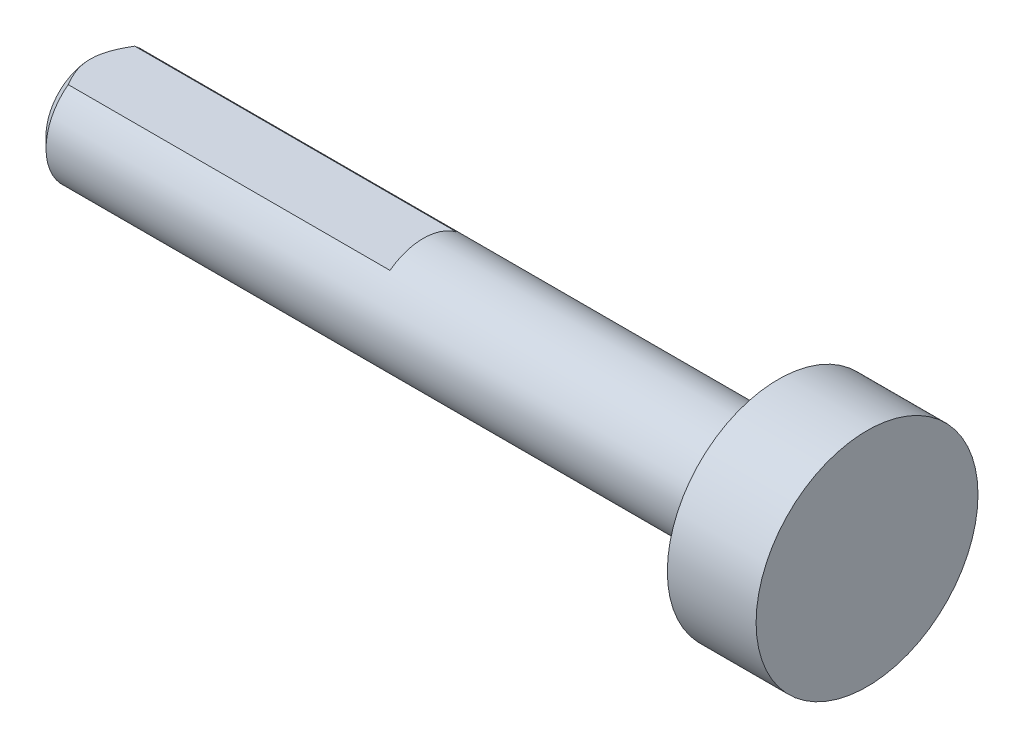
ISO-10303-21;
HEADER;
FILE_DESCRIPTION(('STEP AP214'),'2;1');
FILE_NAME('part.step','',(''),(''),'','','');
FILE_SCHEMA(('AUTOMOTIVE_DESIGN { 1 0 10303 214 1 1 1 1 }'));
ENDSEC;
DATA;
#1=APPLICATION_CONTEXT('core data for automotive mechanical design processes');
#2=APPLICATION_PROTOCOL_DEFINITION('international standard','automotive_design',2000,#1);
#3=PRODUCT_CONTEXT('',#1,'mechanical');
#4=PRODUCT('Part','Part','',(#3));
#5=PRODUCT_RELATED_PRODUCT_CATEGORY('part','',(#4));
#6=PRODUCT_DEFINITION_FORMATION('','',#4);
#7=PRODUCT_DEFINITION_CONTEXT('part definition',#1,'design');
#8=PRODUCT_DEFINITION('design','',#6,#7);
#9=PRODUCT_DEFINITION_SHAPE('','',#8);
#10=(LENGTH_UNIT() NAMED_UNIT(*) SI_UNIT(.MILLI.,.METRE.));
#11=(NAMED_UNIT(*) PLANE_ANGLE_UNIT() SI_UNIT($,.RADIAN.));
#12=(NAMED_UNIT(*) SI_UNIT($,.STERADIAN.) SOLID_ANGLE_UNIT());
#13=UNCERTAINTY_MEASURE_WITH_UNIT(LENGTH_MEASURE(1.E-05),#10,'distance_accuracy_value','');
#14=(GEOMETRIC_REPRESENTATION_CONTEXT(3) GLOBAL_UNCERTAINTY_ASSIGNED_CONTEXT((#13)) GLOBAL_UNIT_ASSIGNED_CONTEXT((#10,
#11,#12)) REPRESENTATION_CONTEXT('',''));
#15=CARTESIAN_POINT('',(0.,0.,0.));
#16=DIRECTION('',(0.,0.,1.));
#17=DIRECTION('',(1.,0.,0.));
#18=AXIS2_PLACEMENT_3D('',#15,#16,#17);
#19=CARTESIAN_POINT('',(-20.,2.,0.));
#20=DIRECTION('',(1.,0.,0.));
#21=DIRECTION('',(0.,0.,-1.));
#22=AXIS2_PLACEMENT_3D('',#19,#20,#21);
#23=PLANE('',#22);
#24=CARTESIAN_POINT('',(-20.,0.,0.));
#25=DIRECTION('',(-1.,0.,0.));
#26=DIRECTION('',(0.,0.,1.));
#27=AXIS2_PLACEMENT_3D('',#24,#25,#26);
#28=CIRCLE('',#27,2.);
#29=CARTESIAN_POINT('',(-20.,2.,0.));
#30=VERTEX_POINT('',#29);
#31=EDGE_CURVE('E65',#30,#30,#28,.T.);
#32=ORIENTED_EDGE('',*,*,#31,.T.);
#33=EDGE_LOOP('',(#32));
#34=FACE_BOUND('',#33,.T.);
#35=ADVANCED_FACE('F16',(#34),#23,.F.);
#36=CARTESIAN_POINT('',(15.,0.,0.));
#37=DIRECTION('',(-1.,0.,0.));
#38=DIRECTION('',(0.,0.,1.));
#39=AXIS2_PLACEMENT_3D('',#36,#37,#38);
#40=PLANE('',#39);
#41=CARTESIAN_POINT('',(15.,0.,0.));
#42=DIRECTION('',(-1.,0.,0.));
#43=DIRECTION('',(0.,0.,1.));
#44=AXIS2_PLACEMENT_3D('',#41,#42,#43);
#45=CIRCLE('',#44,5.);
#46=CARTESIAN_POINT('',(15.,0.,5.));
#47=VERTEX_POINT('',#46);
#48=EDGE_CURVE('E80',#47,#47,#45,.T.);
#49=ORIENTED_EDGE('',*,*,#48,.F.);
#50=EDGE_LOOP('',(#49));
#51=FACE_BOUND('',#50,.T.);
#52=ADVANCED_FACE('F106',(#51),#40,.F.);
#53=CARTESIAN_POINT('',(0.,0.,0.));
#54=DIRECTION('',(-1.,0.,0.));
#55=DIRECTION('',(0.,0.,1.));
#56=AXIS2_PLACEMENT_3D('',#53,#54,#55);
#57=CYLINDRICAL_SURFACE('',#56,5.);
#58=CARTESIAN_POINT('',(11.,0.,0.));
#59=DIRECTION('',(-1.,0.,0.));
#60=DIRECTION('',(0.,0.,1.));
#61=AXIS2_PLACEMENT_3D('',#58,#59,#60);
#62=CIRCLE('',#61,5.);
#63=CARTESIAN_POINT('',(11.,0.,5.));
#64=VERTEX_POINT('',#63);
#65=EDGE_CURVE('E76',#64,#64,#62,.T.);
#66=ORIENTED_EDGE('',*,*,#65,.F.);
#67=EDGE_LOOP('',(#66));
#68=FACE_BOUND('',#67,.T.);
#69=ORIENTED_EDGE('',*,*,#48,.T.);
#70=EDGE_LOOP('',(#69));
#71=FACE_BOUND('',#70,.T.);
#72=ADVANCED_FACE('F103',(#68,#71),#57,.T.);
#73=CARTESIAN_POINT('',(11.,5.,0.));
#74=DIRECTION('',(1.,0.,0.));
#75=DIRECTION('',(0.,0.,-1.));
#76=AXIS2_PLACEMENT_3D('',#73,#74,#75);
#77=PLANE('',#76);
#78=CARTESIAN_POINT('',(11.,0.,0.));
#79=DIRECTION('',(-1.,0.,0.));
#80=DIRECTION('',(0.,0.,1.));
#81=AXIS2_PLACEMENT_3D('',#78,#79,#80);
#82=CIRCLE('',#81,2.5);
#83=CARTESIAN_POINT('',(11.,0.,2.5));
#84=VERTEX_POINT('',#83);
#85=EDGE_CURVE('E72',#84,#84,#82,.T.);
#86=ORIENTED_EDGE('',*,*,#85,.F.);
#87=EDGE_LOOP('',(#86));
#88=FACE_BOUND('',#87,.T.);
#89=ORIENTED_EDGE('',*,*,#65,.T.);
#90=EDGE_LOOP('',(#89));
#91=FACE_BOUND('',#90,.T.);
#92=ADVANCED_FACE('F100',(#88,#91),#77,.F.);
#93=CARTESIAN_POINT('',(0.,0.,0.));
#94=DIRECTION('',(-1.,0.,0.));
#95=DIRECTION('',(0.,0.,1.));
#96=AXIS2_PLACEMENT_3D('',#93,#94,#95);
#97=CYLINDRICAL_SURFACE('',#96,2.5);
#98=CARTESIAN_POINT('',(-5.,0.,0.));
#99=DIRECTION('',(1.,0.,0.));
#100=DIRECTION('',(0.,0.,-1.));
#101=AXIS2_PLACEMENT_3D('',#98,#99,#100);
#102=CIRCLE('',#101,2.5);
#103=CARTESIAN_POINT('',(-5.,2.,-1.5));
#104=VERTEX_POINT('',#103);
#105=CARTESIAN_POINT('',(-5.,2.,1.5));
#106=VERTEX_POINT('',#105);
#107=EDGE_CURVE('E11',#104,#106,#102,.T.);
#108=ORIENTED_EDGE('',*,*,#107,.T.);
#109=DIRECTION('',(-1.,0.,0.));
#110=VECTOR('',#109,1.);
#111=CARTESIAN_POINT('',(0.,2.,1.5));
#112=LINE('',#111,#110);
#113=CARTESIAN_POINT('',(-19.5,2.,1.5));
#114=VERTEX_POINT('',#113);
#115=EDGE_CURVE('E50',#106,#114,#112,.T.);
#116=ORIENTED_EDGE('',*,*,#115,.T.);
#117=CARTESIAN_POINT('',(-19.5,0.,0.));
#118=DIRECTION('',(-1.,0.,0.));
#119=DIRECTION('',(0.,0.,1.));
#120=AXIS2_PLACEMENT_3D('',#117,#118,#119);
#121=CIRCLE('',#120,2.5);
#122=CARTESIAN_POINT('',(-19.5,2.,-1.5));
#123=VERTEX_POINT('',#122);
#124=EDGE_CURVE('E57',#123,#114,#121,.T.);
#125=ORIENTED_EDGE('',*,*,#124,.F.);
#126=DIRECTION('',(-1.,0.,0.));
#127=VECTOR('',#126,1.);
#128=CARTESIAN_POINT('',(0.,2.,-1.5));
#129=LINE('',#128,#127);
#130=EDGE_CURVE('E31',#123,#104,#129,.F.);
#131=ORIENTED_EDGE('',*,*,#130,.T.);
#132=EDGE_LOOP('',(#108,#116,#125,#131));
#133=FACE_BOUND('',#132,.T.);
#134=ORIENTED_EDGE('',*,*,#85,.T.);
#135=EDGE_LOOP('',(#134));
#136=FACE_BOUND('',#135,.T.);
#137=ADVANCED_FACE('F54',(#133,#136),#97,.T.);
#138=CARTESIAN_POINT('',(-19.5,0.,0.));
#139=DIRECTION('',(1.,0.,0.));
#140=DIRECTION('',(0.,0.,-1.));
#141=AXIS2_PLACEMENT_3D('',#138,#139,#140);
#142=CONICAL_SURFACE('',#141,2.5,0.785398163397449);
#143=ORIENTED_EDGE('',*,*,#124,.T.);
#144=CARTESIAN_POINT('',(-17.5052701653353,2.,-4.02524487287732));
#145=CARTESIAN_POINT('',(-17.5875217206694,2.,-3.93338656559502));
#146=CARTESIAN_POINT('',(-17.6694777630484,2.,-3.84126127996532));
#147=CARTESIAN_POINT('',(-17.8326420150682,2.,-3.65633622016191));
#148=CARTESIAN_POINT('',(-17.9138501556328,2.,-3.56353638507521));
#149=CARTESIAN_POINT('',(-18.0756480230058,2.,-3.37679065484127));
#150=CARTESIAN_POINT('',(-18.1562343111819,2.,-3.28284177522373));
#151=CARTESIAN_POINT('',(-18.316241356936,2.,-3.09396170046435));
#152=CARTESIAN_POINT('',(-18.3956621624367,2.,-2.99903054598727));
#153=CARTESIAN_POINT('',(-18.5576618695362,2.,-2.80231868574968));
#154=CARTESIAN_POINT('',(-18.6401511403073,2.,-2.70046395811367));
#155=CARTESIAN_POINT('',(-18.8029394966641,2.,-2.49502065799539));
#156=CARTESIAN_POINT('',(-18.8832387013461,2.,-2.39143218029119));
#157=CARTESIAN_POINT('',(-19.0407552208728,2.,-2.18217141569411));
#158=CARTESIAN_POINT('',(-19.1179769835109,2.,-2.07650249233655));
#159=CARTESIAN_POINT('',(-19.2682890730739,2.,-1.86228016066992));
#160=CARTESIAN_POINT('',(-19.3413806440338,2.,-1.7537276355555));
#161=CARTESIAN_POINT('',(-19.4627220691165,2.,-1.56257875752938));
#162=CARTESIAN_POINT('',(-19.5123596167979,2.,-1.48086803544082));
#163=CARTESIAN_POINT('',(-19.6074104299911,2.,-1.31495821323163));
#164=CARTESIAN_POINT('',(-19.6528221584836,2.,-1.23075822227064));
#165=CARTESIAN_POINT('',(-19.7375500940182,2.,-1.06023902355477));
#166=CARTESIAN_POINT('',(-19.7769166708473,2.,-0.973945152788045));
#167=CARTESIAN_POINT('',(-19.8480658869434,2.,-0.798278775330476));
#168=CARTESIAN_POINT('',(-19.8798544452972,2.,-0.7089087342532));
#169=CARTESIAN_POINT('',(-19.9239554616646,2.,-0.559541387776578));
#170=CARTESIAN_POINT('',(-19.9391736445885,2.,-0.500403045428781));
#171=CARTESIAN_POINT('',(-19.9648450536553,2.,-0.38110862665578));
#172=CARTESIAN_POINT('',(-19.975300236847,2.,-0.320952978783232));
#173=CARTESIAN_POINT('',(-19.9908949804,2.,-0.200181452598232));
#174=CARTESIAN_POINT('',(-19.996054774635,2.,-0.139568224384153));
#175=CARTESIAN_POINT('',(-20.0008382229008,2.,-0.0181203079274203));
#176=CARTESIAN_POINT('',(-20.0004619341049,2.,0.0427143780216636));
#177=CARTESIAN_POINT('',(-19.994208583769,2.,0.163839037596405));
#178=CARTESIAN_POINT('',(-19.9883546366808,2.,0.224130225917891));
#179=CARTESIAN_POINT('',(-19.9715015109567,2.,0.343991547443243));
#180=CARTESIAN_POINT('',(-19.9605011722532,2.,0.403561514966543));
#181=CARTESIAN_POINT('',(-19.9337349239598,2.,0.522342234601762));
#182=CARTESIAN_POINT('',(-19.9179146042935,2.,0.581540567552487));
#183=CARTESIAN_POINT('',(-19.882211279664,2.,0.698671365380507));
#184=CARTESIAN_POINT('',(-19.8623289866357,2.,0.75660405011884));
#185=CARTESIAN_POINT('',(-19.8128560581076,2.,0.88786092774487));
#186=CARTESIAN_POINT('',(-19.7821244984102,2.,0.960752844289545));
#187=CARTESIAN_POINT('',(-19.7161808969028,2.,1.10449637010158));
#188=CARTESIAN_POINT('',(-19.68096648853,2.,1.17534687727371));
#189=CARTESIAN_POINT('',(-19.6069247865527,2.,1.31542984339254));
#190=CARTESIAN_POINT('',(-19.568085539197,2.,1.38465593395302));
#191=CARTESIAN_POINT('',(-19.4876549997555,2.,1.52149299869792));
#192=CARTESIAN_POINT('',(-19.4460633007099,2.,1.58910373202567));
#193=CARTESIAN_POINT('',(-19.3628214933675,2.,1.71962468526325));
#194=CARTESIAN_POINT('',(-19.3212760281916,2.,1.78260199281759));
#195=CARTESIAN_POINT('',(-19.236597871859,2.,1.90748425118616));
#196=CARTESIAN_POINT('',(-19.1934650551546,2.,1.96938911660616));
#197=CARTESIAN_POINT('',(-19.1062912155007,2.,2.09174110166098));
#198=CARTESIAN_POINT('',(-19.0622613860922,2.,2.15219622437775));
#199=CARTESIAN_POINT('',(-18.9731570679666,2.,2.27230748022802));
#200=CARTESIAN_POINT('',(-18.9280828616885,2.,2.3319638226519));
#201=CARTESIAN_POINT('',(-18.882585985681,2.,2.39129047517708));
#202=B_SPLINE_CURVE_WITH_KNOTS('',3,(#144,#145,#146,#147,#148,#149,#150,#151,#152,#153,#154,
#155,#156,#157,#158,#159,#160,#161,#162,#163,#164,#165,#166,#167,#168,#169,#170,#171,#172,#173,
#174,#175,#176,#177,#178,#179,#180,#181,#182,#183,#184,#185,#186,#187,#188,#189,#190,#191,#192,
#193,#194,#195,#196,#197,#198,#199,#200,#201),.UNSPECIFIED.,.F.,.F.,(4,2,2,2,2,2,2,2,2,2,2,2,2,
2,2,2,2,2,2,2,2,2,2,2,2,2,2,2,4),(0.,0.369906577290644,0.739846983359833,1.11116790415776,
1.48247351382392,1.87565592605001,2.26881691411834,2.66138738129621,3.05383896694482,
3.34056558561749,3.62739608846741,3.91168916131565,4.19575944375472,4.37878987167371,
4.56174502701585,4.74399847152434,4.92625003382931,5.10773598829785,5.28926287192739,
5.47292001224255,5.65654499086487,5.89365897291756,6.13089865416152,6.36895036811873,
6.6070373578465,6.83334806436226,7.05967670901656,7.28403255416233,7.50832841730206),.UNSPECIFIED.);
#203=EDGE_CURVE('E24',#114,#30,#202,.F.);
#204=ORIENTED_EDGE('',*,*,#203,.T.);
#205=ORIENTED_EDGE('',*,*,#31,.F.);
#206=EDGE_CURVE('E83',#30,#123,#202,.F.);
#207=ORIENTED_EDGE('',*,*,#206,.T.);
#208=EDGE_LOOP('',(#143,#204,#205,#207));
#209=FACE_BOUND('',#208,.T.);
#210=ADVANCED_FACE('F93',(#209),#142,.T.);
#211=CARTESIAN_POINT('',(-5.,2.5,-3.));
#212=DIRECTION('',(1.,0.,0.));
#213=DIRECTION('',(0.,0.,-1.));
#214=AXIS2_PLACEMENT_3D('',#211,#212,#213);
#215=PLANE('',#214);
#216=DIRECTION('',(0.,0.,1.));
#217=VECTOR('',#216,1.);
#218=CARTESIAN_POINT('',(-5.,2.,-3.));
#219=LINE('',#218,#217);
#220=EDGE_CURVE('E47',#104,#106,#219,.T.);
#221=ORIENTED_EDGE('',*,*,#220,.T.);
#222=ORIENTED_EDGE('',*,*,#107,.F.);
#223=EDGE_LOOP('',(#221,#222));
#224=FACE_BOUND('',#223,.T.);
#225=ADVANCED_FACE('F46',(#224),#215,.F.);
#226=CARTESIAN_POINT('',(-15.,2.,-3.));
#227=DIRECTION('',(0.,-1.,0.));
#228=DIRECTION('',(0.,0.,-1.));
#229=AXIS2_PLACEMENT_3D('',#226,#227,#228);
#230=PLANE('',#229);
#231=ORIENTED_EDGE('',*,*,#220,.F.);
#232=ORIENTED_EDGE('',*,*,#130,.F.);
#233=ORIENTED_EDGE('',*,*,#206,.F.);
#234=ORIENTED_EDGE('',*,*,#203,.F.);
#235=ORIENTED_EDGE('',*,*,#115,.F.);
#236=EDGE_LOOP('',(#231,#232,#233,#234,#235));
#237=FACE_BOUND('',#236,.T.);
#238=ADVANCED_FACE('F49',(#237),#230,.F.);
#239=CLOSED_SHELL('',(#35,#52,#72,#92,#137,#210,#225,#238));
#240=MANIFOLD_SOLID_BREP('B1',#239);
#241=ADVANCED_BREP_SHAPE_REPRESENTATION('',(#18,#240),#14);
#242=SHAPE_DEFINITION_REPRESENTATION(#9,#241);
ENDSEC;
END-ISO-10303-21;
